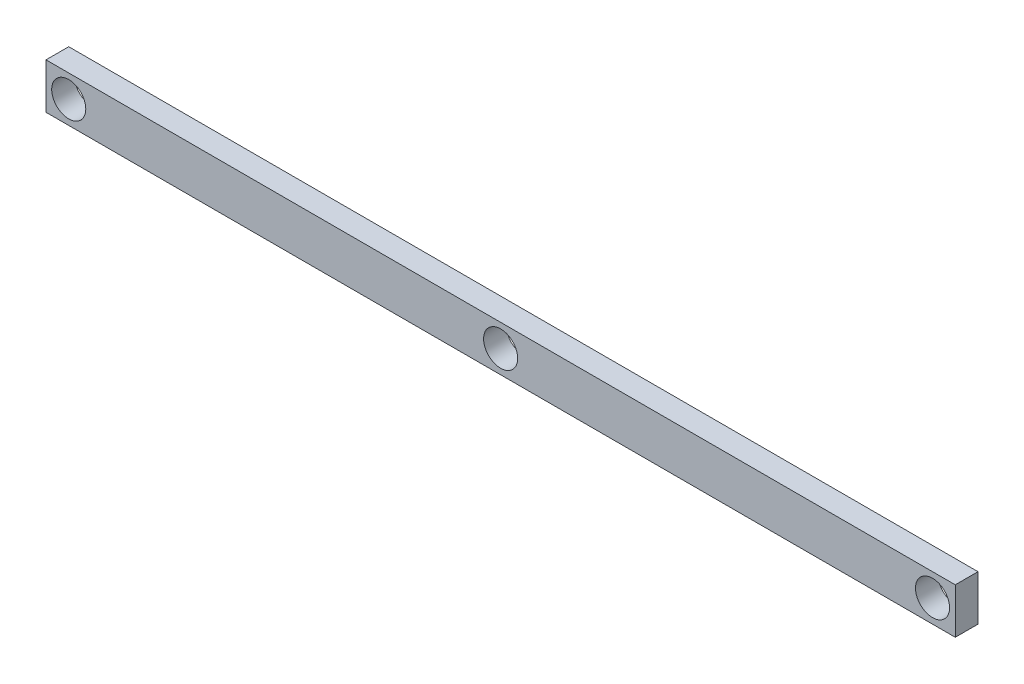
ISO-10303-21;
HEADER;
FILE_DESCRIPTION(('STEP AP214'),'2;1');
FILE_NAME('part.step','',(''),(''),'','','');
FILE_SCHEMA(('AUTOMOTIVE_DESIGN { 1 0 10303 214 1 1 1 1 }'));
ENDSEC;
DATA;
#1=APPLICATION_CONTEXT('core data for automotive mechanical design processes');
#2=APPLICATION_PROTOCOL_DEFINITION('international standard','automotive_design',2000,#1);
#3=PRODUCT_CONTEXT('',#1,'mechanical');
#4=PRODUCT('Part','Part','',(#3));
#5=PRODUCT_RELATED_PRODUCT_CATEGORY('part','',(#4));
#6=PRODUCT_DEFINITION_FORMATION('','',#4);
#7=PRODUCT_DEFINITION_CONTEXT('part definition',#1,'design');
#8=PRODUCT_DEFINITION('design','',#6,#7);
#9=PRODUCT_DEFINITION_SHAPE('','',#8);
#10=(LENGTH_UNIT() NAMED_UNIT(*) SI_UNIT(.MILLI.,.METRE.));
#11=(NAMED_UNIT(*) PLANE_ANGLE_UNIT() SI_UNIT($,.RADIAN.));
#12=(NAMED_UNIT(*) SI_UNIT($,.STERADIAN.) SOLID_ANGLE_UNIT());
#13=UNCERTAINTY_MEASURE_WITH_UNIT(LENGTH_MEASURE(1.E-05),#10,'distance_accuracy_value','');
#14=(GEOMETRIC_REPRESENTATION_CONTEXT(3) GLOBAL_UNCERTAINTY_ASSIGNED_CONTEXT((#13)) GLOBAL_UNIT_ASSIGNED_CONTEXT((#10,
#11,#12)) REPRESENTATION_CONTEXT('',''));
#15=CARTESIAN_POINT('',(0.,0.,0.));
#16=DIRECTION('',(0.,0.,1.));
#17=DIRECTION('',(1.,0.,0.));
#18=AXIS2_PLACEMENT_3D('',#15,#16,#17);
#19=CARTESIAN_POINT('',(0.,2.,0.));
#20=DIRECTION('',(1.,0.,0.));
#21=DIRECTION('',(0.,0.,-1.));
#22=AXIS2_PLACEMENT_3D('',#19,#20,#21);
#23=PLANE('',#22);
#24=DIRECTION('',(0.,0.,1.));
#25=VECTOR('',#24,1.);
#26=CARTESIAN_POINT('',(0.,2.,0.));
#27=LINE('',#26,#25);
#28=CARTESIAN_POINT('',(0.,2.,-1.));
#29=VERTEX_POINT('',#28);
#30=CARTESIAN_POINT('',(0.,2.,0.));
#31=VERTEX_POINT('',#30);
#32=EDGE_CURVE('E88',#29,#31,#27,.T.);
#33=ORIENTED_EDGE('',*,*,#32,.F.);
#34=DIRECTION('',(0.,1.,0.));
#35=VECTOR('',#34,1.);
#36=CARTESIAN_POINT('',(0.,0.,-1.));
#37=LINE('',#36,#35);
#38=CARTESIAN_POINT('',(0.,0.,-1.));
#39=VERTEX_POINT('',#38);
#40=EDGE_CURVE('E95',#39,#29,#37,.T.);
#41=ORIENTED_EDGE('',*,*,#40,.F.);
#42=DIRECTION('',(0.,0.,1.));
#43=VECTOR('',#42,1.);
#44=CARTESIAN_POINT('',(0.,0.,0.));
#45=LINE('',#44,#43);
#46=CARTESIAN_POINT('',(0.,0.,0.));
#47=VERTEX_POINT('',#46);
#48=EDGE_CURVE('E80',#39,#47,#45,.T.);
#49=ORIENTED_EDGE('',*,*,#48,.T.);
#50=DIRECTION('',(0.,-1.,0.));
#51=VECTOR('',#50,1.);
#52=CARTESIAN_POINT('',(0.,2.,0.));
#53=LINE('',#52,#51);
#54=EDGE_CURVE('E11',#31,#47,#53,.T.);
#55=ORIENTED_EDGE('',*,*,#54,.F.);
#56=EDGE_LOOP('',(#33,#41,#49,#55));
#57=FACE_BOUND('',#56,.T.);
#58=ADVANCED_FACE('F36',(#57),#23,.F.);
#59=CARTESIAN_POINT('',(0.,2.,0.));
#60=DIRECTION('',(0.,0.,-1.));
#61=DIRECTION('',(-1.,0.,0.));
#62=AXIS2_PLACEMENT_3D('',#59,#60,#61);
#63=PLANE('',#62);
#64=CARTESIAN_POINT('',(1.,1.,0.));
#65=DIRECTION('',(0.,0.,1.));
#66=DIRECTION('',(1.,0.,0.));
#67=AXIS2_PLACEMENT_3D('',#64,#65,#66);
#68=CIRCLE('',#67,0.75);
#69=CARTESIAN_POINT('',(1.75,1.,0.));
#70=VERTEX_POINT('',#69);
#71=EDGE_CURVE('E109',#70,#70,#68,.T.);
#72=ORIENTED_EDGE('',*,*,#71,.F.);
#73=EDGE_LOOP('',(#72));
#74=FACE_BOUND('',#73,.T.);
#75=CARTESIAN_POINT('',(39.,1.,0.));
#76=DIRECTION('',(0.,0.,1.));
#77=DIRECTION('',(1.,0.,0.));
#78=AXIS2_PLACEMENT_3D('',#75,#76,#77);
#79=CIRCLE('',#78,0.749999999999999);
#80=CARTESIAN_POINT('',(39.75,1.,0.));
#81=VERTEX_POINT('',#80);
#82=EDGE_CURVE('E115',#81,#81,#79,.T.);
#83=ORIENTED_EDGE('',*,*,#82,.F.);
#84=EDGE_LOOP('',(#83));
#85=FACE_BOUND('',#84,.T.);
#86=CARTESIAN_POINT('',(20.,1.,0.));
#87=DIRECTION('',(0.,0.,1.));
#88=DIRECTION('',(1.,0.,0.));
#89=AXIS2_PLACEMENT_3D('',#86,#87,#88);
#90=CIRCLE('',#89,0.750000000000002);
#91=CARTESIAN_POINT('',(20.75,1.,0.));
#92=VERTEX_POINT('',#91);
#93=EDGE_CURVE('E103',#92,#92,#90,.T.);
#94=ORIENTED_EDGE('',*,*,#93,.F.);
#95=EDGE_LOOP('',(#94));
#96=FACE_BOUND('',#95,.T.);
#97=DIRECTION('',(1.,0.,0.));
#98=VECTOR('',#97,1.);
#99=CARTESIAN_POINT('',(0.,0.,0.));
#100=LINE('',#99,#98);
#101=CARTESIAN_POINT('',(40.,0.,0.));
#102=VERTEX_POINT('',#101);
#103=EDGE_CURVE('E71',#47,#102,#100,.T.);
#104=ORIENTED_EDGE('',*,*,#103,.T.);
#105=DIRECTION('',(0.,-1.,0.));
#106=VECTOR('',#105,1.);
#107=CARTESIAN_POINT('',(40.,2.,0.));
#108=LINE('',#107,#106);
#109=CARTESIAN_POINT('',(40.,2.,0.));
#110=VERTEX_POINT('',#109);
#111=EDGE_CURVE('E43',#110,#102,#108,.T.);
#112=ORIENTED_EDGE('',*,*,#111,.F.);
#113=DIRECTION('',(1.,0.,0.));
#114=VECTOR('',#113,1.);
#115=CARTESIAN_POINT('',(0.,2.,0.));
#116=LINE('',#115,#114);
#117=EDGE_CURVE('E59',#31,#110,#116,.T.);
#118=ORIENTED_EDGE('',*,*,#117,.F.);
#119=ORIENTED_EDGE('',*,*,#54,.T.);
#120=EDGE_LOOP('',(#104,#112,#118,#119));
#121=FACE_BOUND('',#120,.T.);
#122=ADVANCED_FACE('F73',(#74,#85,#96,#121),#63,.F.);
#123=CARTESIAN_POINT('',(40.,2.,0.));
#124=DIRECTION('',(-1.,0.,0.));
#125=DIRECTION('',(0.,0.,1.));
#126=AXIS2_PLACEMENT_3D('',#123,#124,#125);
#127=PLANE('',#126);
#128=DIRECTION('',(0.,0.,-1.));
#129=VECTOR('',#128,1.);
#130=CARTESIAN_POINT('',(40.,0.,0.));
#131=LINE('',#130,#129);
#132=CARTESIAN_POINT('',(40.,0.,-1.));
#133=VERTEX_POINT('',#132);
#134=EDGE_CURVE('E79',#102,#133,#131,.T.);
#135=ORIENTED_EDGE('',*,*,#134,.T.);
#136=DIRECTION('',(0.,1.,0.));
#137=VECTOR('',#136,1.);
#138=CARTESIAN_POINT('',(40.,0.,-1.));
#139=LINE('',#138,#137);
#140=CARTESIAN_POINT('',(40.,2.,-1.));
#141=VERTEX_POINT('',#140);
#142=EDGE_CURVE('E50',#133,#141,#139,.T.);
#143=ORIENTED_EDGE('',*,*,#142,.T.);
#144=DIRECTION('',(0.,0.,-1.));
#145=VECTOR('',#144,1.);
#146=CARTESIAN_POINT('',(40.,2.,0.));
#147=LINE('',#146,#145);
#148=EDGE_CURVE('E85',#110,#141,#147,.T.);
#149=ORIENTED_EDGE('',*,*,#148,.F.);
#150=ORIENTED_EDGE('',*,*,#111,.T.);
#151=EDGE_LOOP('',(#135,#143,#149,#150));
#152=FACE_BOUND('',#151,.T.);
#153=ADVANCED_FACE('F84',(#152),#127,.F.);
#154=CARTESIAN_POINT('',(0.,2.,0.));
#155=DIRECTION('',(0.,-1.,0.));
#156=DIRECTION('',(0.,0.,-1.));
#157=AXIS2_PLACEMENT_3D('',#154,#155,#156);
#158=PLANE('',#157);
#159=ORIENTED_EDGE('',*,*,#148,.T.);
#160=DIRECTION('',(1.,0.,0.));
#161=VECTOR('',#160,1.);
#162=CARTESIAN_POINT('',(40.,2.,-1.));
#163=LINE('',#162,#161);
#164=EDGE_CURVE('E99',#29,#141,#163,.T.);
#165=ORIENTED_EDGE('',*,*,#164,.F.);
#166=ORIENTED_EDGE('',*,*,#32,.T.);
#167=ORIENTED_EDGE('',*,*,#117,.T.);
#168=EDGE_LOOP('',(#159,#165,#166,#167));
#169=FACE_BOUND('',#168,.T.);
#170=ADVANCED_FACE('F157',(#169),#158,.F.);
#171=CARTESIAN_POINT('',(0.,0.,0.));
#172=DIRECTION('',(0.,-1.,0.));
#173=DIRECTION('',(0.,0.,-1.));
#174=AXIS2_PLACEMENT_3D('',#171,#172,#173);
#175=PLANE('',#174);
#176=DIRECTION('',(1.,0.,0.));
#177=VECTOR('',#176,1.);
#178=CARTESIAN_POINT('',(40.,0.,-1.));
#179=LINE('',#178,#177);
#180=EDGE_CURVE('E87',#39,#133,#179,.T.);
#181=ORIENTED_EDGE('',*,*,#180,.T.);
#182=ORIENTED_EDGE('',*,*,#134,.F.);
#183=ORIENTED_EDGE('',*,*,#103,.F.);
#184=ORIENTED_EDGE('',*,*,#48,.F.);
#185=EDGE_LOOP('',(#181,#182,#183,#184));
#186=FACE_BOUND('',#185,.T.);
#187=ADVANCED_FACE('F86',(#186),#175,.T.);
#188=CARTESIAN_POINT('',(40.,0.,-1.));
#189=DIRECTION('',(0.,0.,1.));
#190=DIRECTION('',(1.,0.,0.));
#191=AXIS2_PLACEMENT_3D('',#188,#189,#190);
#192=PLANE('',#191);
#193=CARTESIAN_POINT('',(1.,1.,-1.));
#194=DIRECTION('',(0.,0.,1.));
#195=DIRECTION('',(1.,0.,0.));
#196=AXIS2_PLACEMENT_3D('',#193,#194,#195);
#197=CIRCLE('',#196,0.75);
#198=CARTESIAN_POINT('',(1.75,1.,-1.));
#199=VERTEX_POINT('',#198);
#200=EDGE_CURVE('E112',#199,#199,#197,.T.);
#201=ORIENTED_EDGE('',*,*,#200,.T.);
#202=EDGE_LOOP('',(#201));
#203=FACE_BOUND('',#202,.T.);
#204=CARTESIAN_POINT('',(39.,1.,-1.));
#205=DIRECTION('',(0.,0.,1.));
#206=DIRECTION('',(1.,0.,0.));
#207=AXIS2_PLACEMENT_3D('',#204,#205,#206);
#208=CIRCLE('',#207,0.749999999999999);
#209=CARTESIAN_POINT('',(39.75,1.,-1.));
#210=VERTEX_POINT('',#209);
#211=EDGE_CURVE('E106',#210,#210,#208,.T.);
#212=ORIENTED_EDGE('',*,*,#211,.T.);
#213=EDGE_LOOP('',(#212));
#214=FACE_BOUND('',#213,.T.);
#215=CARTESIAN_POINT('',(20.,1.,-1.));
#216=DIRECTION('',(0.,0.,1.));
#217=DIRECTION('',(1.,0.,0.));
#218=AXIS2_PLACEMENT_3D('',#215,#216,#217);
#219=CIRCLE('',#218,0.750000000000002);
#220=CARTESIAN_POINT('',(20.75,1.,-1.));
#221=VERTEX_POINT('',#220);
#222=EDGE_CURVE('E101',#221,#221,#219,.T.);
#223=ORIENTED_EDGE('',*,*,#222,.T.);
#224=EDGE_LOOP('',(#223));
#225=FACE_BOUND('',#224,.T.);
#226=ORIENTED_EDGE('',*,*,#164,.T.);
#227=ORIENTED_EDGE('',*,*,#142,.F.);
#228=ORIENTED_EDGE('',*,*,#180,.F.);
#229=ORIENTED_EDGE('',*,*,#40,.T.);
#230=EDGE_LOOP('',(#226,#227,#228,#229));
#231=FACE_BOUND('',#230,.T.);
#232=ADVANCED_FACE('F121',(#203,#214,#225,#231),#192,.F.);
#233=CARTESIAN_POINT('',(20.,1.,-1.));
#234=DIRECTION('',(0.,0.,1.));
#235=DIRECTION('',(1.,0.,0.));
#236=AXIS2_PLACEMENT_3D('',#233,#234,#235);
#237=CYLINDRICAL_SURFACE('',#236,0.750000000000002);
#238=ORIENTED_EDGE('',*,*,#222,.F.);
#239=EDGE_LOOP('',(#238));
#240=FACE_BOUND('',#239,.T.);
#241=ORIENTED_EDGE('',*,*,#93,.T.);
#242=EDGE_LOOP('',(#241));
#243=FACE_BOUND('',#242,.T.);
#244=ADVANCED_FACE('F128',(#240,#243),#237,.F.);
#245=CARTESIAN_POINT('',(39.,1.,-1.));
#246=DIRECTION('',(0.,0.,1.));
#247=DIRECTION('',(1.,0.,0.));
#248=AXIS2_PLACEMENT_3D('',#245,#246,#247);
#249=CYLINDRICAL_SURFACE('',#248,0.749999999999999);
#250=ORIENTED_EDGE('',*,*,#211,.F.);
#251=EDGE_LOOP('',(#250));
#252=FACE_BOUND('',#251,.T.);
#253=ORIENTED_EDGE('',*,*,#82,.T.);
#254=EDGE_LOOP('',(#253));
#255=FACE_BOUND('',#254,.T.);
#256=ADVANCED_FACE('F124',(#252,#255),#249,.F.);
#257=CARTESIAN_POINT('',(1.,1.,-1.));
#258=DIRECTION('',(0.,0.,1.));
#259=DIRECTION('',(1.,0.,0.));
#260=AXIS2_PLACEMENT_3D('',#257,#258,#259);
#261=CYLINDRICAL_SURFACE('',#260,0.75);
#262=ORIENTED_EDGE('',*,*,#200,.F.);
#263=EDGE_LOOP('',(#262));
#264=FACE_BOUND('',#263,.T.);
#265=ORIENTED_EDGE('',*,*,#71,.T.);
#266=EDGE_LOOP('',(#265));
#267=FACE_BOUND('',#266,.T.);
#268=ADVANCED_FACE('F127',(#264,#267),#261,.F.);
#269=CLOSED_SHELL('',(#58,#122,#153,#170,#187,#232,#244,#256,#268));
#270=MANIFOLD_SOLID_BREP('B2',#269);
#271=ADVANCED_BREP_SHAPE_REPRESENTATION('',(#18,#270),#14);
#272=SHAPE_DEFINITION_REPRESENTATION(#9,#271);
ENDSEC;
END-ISO-10303-21;
